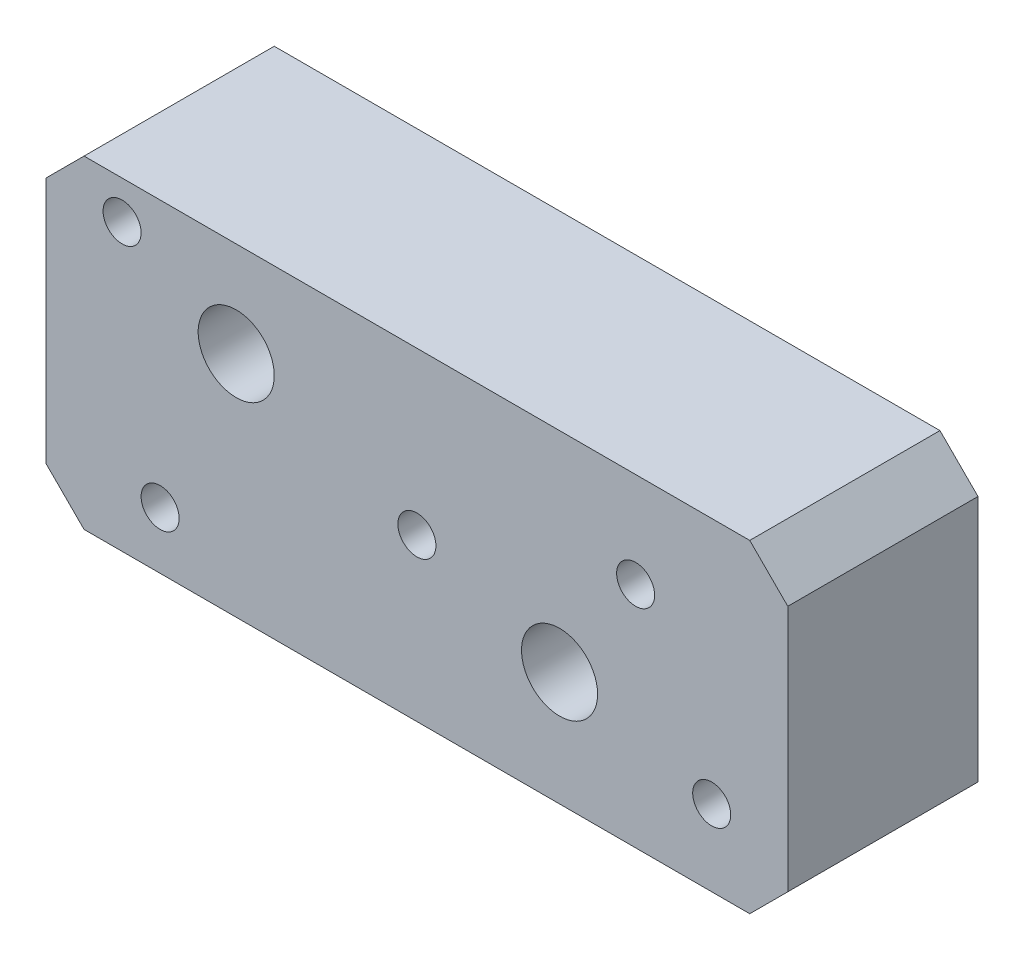
ISO-10303-21;
HEADER;
FILE_DESCRIPTION(('STEP AP214'),'2;1');
FILE_NAME('part.step','',(''),(''),'','','');
FILE_SCHEMA(('AUTOMOTIVE_DESIGN { 1 0 10303 214 1 1 1 1 }'));
ENDSEC;
DATA;
#1=APPLICATION_CONTEXT('core data for automotive mechanical design processes');
#2=APPLICATION_PROTOCOL_DEFINITION('international standard','automotive_design',2000,#1);
#3=PRODUCT_CONTEXT('',#1,'mechanical');
#4=PRODUCT('Part','Part','',(#3));
#5=PRODUCT_RELATED_PRODUCT_CATEGORY('part','',(#4));
#6=PRODUCT_DEFINITION_FORMATION('','',#4);
#7=PRODUCT_DEFINITION_CONTEXT('part definition',#1,'design');
#8=PRODUCT_DEFINITION('design','',#6,#7);
#9=PRODUCT_DEFINITION_SHAPE('','',#8);
#10=(LENGTH_UNIT() NAMED_UNIT(*) SI_UNIT(.MILLI.,.METRE.));
#11=(NAMED_UNIT(*) PLANE_ANGLE_UNIT() SI_UNIT($,.RADIAN.));
#12=(NAMED_UNIT(*) SI_UNIT($,.STERADIAN.) SOLID_ANGLE_UNIT());
#13=UNCERTAINTY_MEASURE_WITH_UNIT(LENGTH_MEASURE(1.E-05),#10,'distance_accuracy_value','');
#14=(GEOMETRIC_REPRESENTATION_CONTEXT(3) GLOBAL_UNCERTAINTY_ASSIGNED_CONTEXT((#13)) GLOBAL_UNIT_ASSIGNED_CONTEXT((#10,
#11,#12)) REPRESENTATION_CONTEXT('',''));
#15=CARTESIAN_POINT('',(0.,0.,0.));
#16=DIRECTION('',(0.,0.,1.));
#17=DIRECTION('',(1.,0.,0.));
#18=AXIS2_PLACEMENT_3D('',#15,#16,#17);
#19=CARTESIAN_POINT('',(0.,0.,5.));
#20=DIRECTION('',(0.,0.,-1.));
#21=DIRECTION('',(-1.,0.,0.));
#22=AXIS2_PLACEMENT_3D('',#19,#20,#21);
#23=PLANE('',#22);
#24=DIRECTION('',(-1.,0.,0.));
#25=VECTOR('',#24,1.);
#26=CARTESIAN_POINT('',(17.5,8.5,5.));
#27=LINE('',#26,#25);
#28=CARTESIAN_POINT('',(17.5,8.5,5.));
#29=VERTEX_POINT('',#28);
#30=CARTESIAN_POINT('',(-17.5,8.5,5.));
#31=VERTEX_POINT('',#30);
#32=EDGE_CURVE('E168',#29,#31,#27,.T.);
#33=ORIENTED_EDGE('',*,*,#32,.T.);
#34=DIRECTION('',(-0.707106781186547,-0.707106781186548,0.));
#35=VECTOR('',#34,1.);
#36=CARTESIAN_POINT('',(-17.5,8.5,5.));
#37=LINE('',#36,#35);
#38=CARTESIAN_POINT('',(-19.5,6.50000000000001,5.));
#39=VERTEX_POINT('',#38);
#40=EDGE_CURVE('E104',#31,#39,#37,.T.);
#41=ORIENTED_EDGE('',*,*,#40,.T.);
#42=DIRECTION('',(0.,-1.,0.));
#43=VECTOR('',#42,1.);
#44=CARTESIAN_POINT('',(-19.5,-6.50000000000001,5.));
#45=LINE('',#44,#43);
#46=CARTESIAN_POINT('',(-19.5,-6.50000000000001,5.));
#47=VERTEX_POINT('',#46);
#48=EDGE_CURVE('E189',#39,#47,#45,.T.);
#49=ORIENTED_EDGE('',*,*,#48,.T.);
#50=DIRECTION('',(0.707106781186548,-0.707106781186547,0.));
#51=VECTOR('',#50,1.);
#52=CARTESIAN_POINT('',(-17.5,-8.5,5.));
#53=LINE('',#52,#51);
#54=CARTESIAN_POINT('',(-17.5,-8.5,5.));
#55=VERTEX_POINT('',#54);
#56=EDGE_CURVE('E203',#47,#55,#53,.T.);
#57=ORIENTED_EDGE('',*,*,#56,.T.);
#58=DIRECTION('',(1.,0.,0.));
#59=VECTOR('',#58,1.);
#60=CARTESIAN_POINT('',(17.5,-8.49999999999999,5.));
#61=LINE('',#60,#59);
#62=CARTESIAN_POINT('',(17.5,-8.49999999999999,5.));
#63=VERTEX_POINT('',#62);
#64=EDGE_CURVE('E123',#55,#63,#61,.T.);
#65=ORIENTED_EDGE('',*,*,#64,.T.);
#66=DIRECTION('',(0.707106781186549,0.707106781186546,0.));
#67=VECTOR('',#66,1.);
#68=CARTESIAN_POINT('',(19.5,-6.5,5.));
#69=LINE('',#68,#67);
#70=CARTESIAN_POINT('',(19.5,-6.5,5.));
#71=VERTEX_POINT('',#70);
#72=EDGE_CURVE('E117',#63,#71,#69,.T.);
#73=ORIENTED_EDGE('',*,*,#72,.T.);
#74=DIRECTION('',(0.,1.,0.));
#75=VECTOR('',#74,1.);
#76=CARTESIAN_POINT('',(19.5,-6.5,5.));
#77=LINE('',#76,#75);
#78=CARTESIAN_POINT('',(19.5,6.5,5.));
#79=VERTEX_POINT('',#78);
#80=EDGE_CURVE('E121',#71,#79,#77,.T.);
#81=ORIENTED_EDGE('',*,*,#80,.T.);
#82=DIRECTION('',(-0.707106781186545,0.70710678118655,0.));
#83=VECTOR('',#82,1.);
#84=CARTESIAN_POINT('',(19.5,6.5,5.));
#85=LINE('',#84,#83);
#86=EDGE_CURVE('E61',#79,#29,#85,.T.);
#87=ORIENTED_EDGE('',*,*,#86,.T.);
#88=EDGE_LOOP('',(#33,#41,#49,#57,#65,#73,#81,#87));
#89=FACE_BOUND('',#88,.T.);
#90=CARTESIAN_POINT('',(0.,0.,5.));
#91=DIRECTION('',(0.,0.,1.));
#92=DIRECTION('',(1.,0.,0.));
#93=AXIS2_PLACEMENT_3D('',#90,#91,#92);
#94=CIRCLE('',#93,1.);
#95=CARTESIAN_POINT('',(1.,0.,5.));
#96=VERTEX_POINT('',#95);
#97=EDGE_CURVE('E150',#96,#96,#94,.T.);
#98=ORIENTED_EDGE('',*,*,#97,.F.);
#99=EDGE_LOOP('',(#98));
#100=FACE_BOUND('',#99,.T.);
#101=CARTESIAN_POINT('',(-13.5,-5.5,5.));
#102=DIRECTION('',(0.,0.,1.));
#103=DIRECTION('',(1.,0.,0.));
#104=AXIS2_PLACEMENT_3D('',#101,#102,#103);
#105=CIRCLE('',#104,1.);
#106=CARTESIAN_POINT('',(-12.5,-5.5,5.));
#107=VERTEX_POINT('',#106);
#108=EDGE_CURVE('E217',#107,#107,#105,.T.);
#109=ORIENTED_EDGE('',*,*,#108,.F.);
#110=EDGE_LOOP('',(#109));
#111=FACE_BOUND('',#110,.T.);
#112=CARTESIAN_POINT('',(-15.5,6.5,5.));
#113=DIRECTION('',(0.,0.,1.));
#114=DIRECTION('',(1.,0.,0.));
#115=AXIS2_PLACEMENT_3D('',#112,#113,#114);
#116=CIRCLE('',#115,1.);
#117=CARTESIAN_POINT('',(-14.5,6.5,5.));
#118=VERTEX_POINT('',#117);
#119=EDGE_CURVE('E225',#118,#118,#116,.T.);
#120=ORIENTED_EDGE('',*,*,#119,.F.);
#121=EDGE_LOOP('',(#120));
#122=FACE_BOUND('',#121,.T.);
#123=CARTESIAN_POINT('',(-9.5,3.5,5.));
#124=DIRECTION('',(0.,0.,1.));
#125=DIRECTION('',(1.,0.,0.));
#126=AXIS2_PLACEMENT_3D('',#123,#124,#125);
#127=CIRCLE('',#126,2.);
#128=CARTESIAN_POINT('',(-7.5,3.5,5.));
#129=VERTEX_POINT('',#128);
#130=EDGE_CURVE('E233',#129,#129,#127,.T.);
#131=ORIENTED_EDGE('',*,*,#130,.F.);
#132=EDGE_LOOP('',(#131));
#133=FACE_BOUND('',#132,.T.);
#134=CARTESIAN_POINT('',(7.5,-2.5,5.));
#135=DIRECTION('',(0.,0.,1.));
#136=DIRECTION('',(1.,0.,0.));
#137=AXIS2_PLACEMENT_3D('',#134,#135,#136);
#138=CIRCLE('',#137,2.);
#139=CARTESIAN_POINT('',(9.5,-2.5,5.));
#140=VERTEX_POINT('',#139);
#141=EDGE_CURVE('E241',#140,#140,#138,.T.);
#142=ORIENTED_EDGE('',*,*,#141,.F.);
#143=EDGE_LOOP('',(#142));
#144=FACE_BOUND('',#143,.T.);
#145=CARTESIAN_POINT('',(15.5,-4.5,5.));
#146=DIRECTION('',(0.,0.,1.));
#147=DIRECTION('',(1.,0.,0.));
#148=AXIS2_PLACEMENT_3D('',#145,#146,#147);
#149=CIRCLE('',#148,1.);
#150=CARTESIAN_POINT('',(16.5,-4.5,5.));
#151=VERTEX_POINT('',#150);
#152=EDGE_CURVE('E249',#151,#151,#149,.T.);
#153=ORIENTED_EDGE('',*,*,#152,.F.);
#154=EDGE_LOOP('',(#153));
#155=FACE_BOUND('',#154,.T.);
#156=CARTESIAN_POINT('',(11.5,3.5,5.));
#157=DIRECTION('',(0.,0.,1.));
#158=DIRECTION('',(1.,0.,0.));
#159=AXIS2_PLACEMENT_3D('',#156,#157,#158);
#160=CIRCLE('',#159,1.);
#161=CARTESIAN_POINT('',(12.5,3.5,5.));
#162=VERTEX_POINT('',#161);
#163=EDGE_CURVE('E257',#162,#162,#160,.T.);
#164=ORIENTED_EDGE('',*,*,#163,.F.);
#165=EDGE_LOOP('',(#164));
#166=FACE_BOUND('',#165,.T.);
#167=ADVANCED_FACE('F43',(#89,#100,#111,#122,#133,#144,#155,#166),#23,.F.);
#168=CARTESIAN_POINT('',(0.,0.,-5.));
#169=DIRECTION('',(0.,0.,-1.));
#170=DIRECTION('',(-1.,0.,0.));
#171=AXIS2_PLACEMENT_3D('',#168,#169,#170);
#172=PLANE('',#171);
#173=CARTESIAN_POINT('',(15.5,-4.5,-5.));
#174=DIRECTION('',(0.,0.,1.));
#175=DIRECTION('',(1.,0.,0.));
#176=AXIS2_PLACEMENT_3D('',#173,#174,#175);
#177=CIRCLE('',#176,1.);
#178=CARTESIAN_POINT('',(16.5,-4.5,-5.));
#179=VERTEX_POINT('',#178);
#180=EDGE_CURVE('E253',#179,#179,#177,.T.);
#181=ORIENTED_EDGE('',*,*,#180,.T.);
#182=EDGE_LOOP('',(#181));
#183=FACE_BOUND('',#182,.T.);
#184=CARTESIAN_POINT('',(-9.5,3.5,-5.));
#185=DIRECTION('',(0.,0.,1.));
#186=DIRECTION('',(1.,0.,0.));
#187=AXIS2_PLACEMENT_3D('',#184,#185,#186);
#188=CIRCLE('',#187,2.);
#189=CARTESIAN_POINT('',(-7.5,3.5,-5.));
#190=VERTEX_POINT('',#189);
#191=EDGE_CURVE('E237',#190,#190,#188,.T.);
#192=ORIENTED_EDGE('',*,*,#191,.T.);
#193=EDGE_LOOP('',(#192));
#194=FACE_BOUND('',#193,.T.);
#195=CARTESIAN_POINT('',(-13.5,-5.5,-5.));
#196=DIRECTION('',(0.,0.,1.));
#197=DIRECTION('',(1.,0.,0.));
#198=AXIS2_PLACEMENT_3D('',#195,#196,#197);
#199=CIRCLE('',#198,1.);
#200=CARTESIAN_POINT('',(-12.5,-5.5,-5.));
#201=VERTEX_POINT('',#200);
#202=EDGE_CURVE('E221',#201,#201,#199,.T.);
#203=ORIENTED_EDGE('',*,*,#202,.T.);
#204=EDGE_LOOP('',(#203));
#205=FACE_BOUND('',#204,.T.);
#206=DIRECTION('',(-1.,0.,0.));
#207=VECTOR('',#206,1.);
#208=CARTESIAN_POINT('',(17.5,8.5,-5.));
#209=LINE('',#208,#207);
#210=CARTESIAN_POINT('',(17.5,8.5,-5.));
#211=VERTEX_POINT('',#210);
#212=CARTESIAN_POINT('',(-17.5,8.5,-5.));
#213=VERTEX_POINT('',#212);
#214=EDGE_CURVE('E145',#211,#213,#209,.T.);
#215=ORIENTED_EDGE('',*,*,#214,.F.);
#216=DIRECTION('',(-0.707106781186545,0.70710678118655,0.));
#217=VECTOR('',#216,1.);
#218=CARTESIAN_POINT('',(19.5,6.5,-5.));
#219=LINE('',#218,#217);
#220=CARTESIAN_POINT('',(19.5,6.5,-5.));
#221=VERTEX_POINT('',#220);
#222=EDGE_CURVE('E96',#221,#211,#219,.T.);
#223=ORIENTED_EDGE('',*,*,#222,.F.);
#224=DIRECTION('',(0.,1.,0.));
#225=VECTOR('',#224,1.);
#226=CARTESIAN_POINT('',(19.5,-6.5,-5.));
#227=LINE('',#226,#225);
#228=CARTESIAN_POINT('',(19.5,-6.5,-5.));
#229=VERTEX_POINT('',#228);
#230=EDGE_CURVE('E90',#229,#221,#227,.T.);
#231=ORIENTED_EDGE('',*,*,#230,.F.);
#232=DIRECTION('',(0.707106781186549,0.707106781186546,0.));
#233=VECTOR('',#232,1.);
#234=CARTESIAN_POINT('',(19.5,-6.5,-5.));
#235=LINE('',#234,#233);
#236=CARTESIAN_POINT('',(17.5,-8.49999999999999,-5.));
#237=VERTEX_POINT('',#236);
#238=EDGE_CURVE('E132',#237,#229,#235,.T.);
#239=ORIENTED_EDGE('',*,*,#238,.F.);
#240=DIRECTION('',(1.,0.,0.));
#241=VECTOR('',#240,1.);
#242=CARTESIAN_POINT('',(17.5,-8.49999999999999,-5.));
#243=LINE('',#242,#241);
#244=CARTESIAN_POINT('',(-17.5,-8.5,-5.));
#245=VERTEX_POINT('',#244);
#246=EDGE_CURVE('E159',#245,#237,#243,.T.);
#247=ORIENTED_EDGE('',*,*,#246,.F.);
#248=DIRECTION('',(0.707106781186548,-0.707106781186547,0.));
#249=VECTOR('',#248,1.);
#250=CARTESIAN_POINT('',(-17.5,-8.5,-5.));
#251=LINE('',#250,#249);
#252=CARTESIAN_POINT('',(-19.5,-6.50000000000001,-5.));
#253=VERTEX_POINT('',#252);
#254=EDGE_CURVE('E156',#253,#245,#251,.T.);
#255=ORIENTED_EDGE('',*,*,#254,.F.);
#256=DIRECTION('',(0.,-1.,0.));
#257=VECTOR('',#256,1.);
#258=CARTESIAN_POINT('',(-19.5,-6.50000000000001,-5.));
#259=LINE('',#258,#257);
#260=CARTESIAN_POINT('',(-19.5,6.50000000000001,-5.));
#261=VERTEX_POINT('',#260);
#262=EDGE_CURVE('E153',#261,#253,#259,.T.);
#263=ORIENTED_EDGE('',*,*,#262,.F.);
#264=DIRECTION('',(-0.707106781186547,-0.707106781186548,0.));
#265=VECTOR('',#264,1.);
#266=CARTESIAN_POINT('',(-17.5,8.5,-5.));
#267=LINE('',#266,#265);
#268=EDGE_CURVE('E149',#213,#261,#267,.T.);
#269=ORIENTED_EDGE('',*,*,#268,.F.);
#270=EDGE_LOOP('',(#215,#223,#231,#239,#247,#255,#263,#269));
#271=FACE_BOUND('',#270,.T.);
#272=CARTESIAN_POINT('',(0.,0.,-5.));
#273=DIRECTION('',(0.,0.,1.));
#274=DIRECTION('',(1.,0.,0.));
#275=AXIS2_PLACEMENT_3D('',#272,#273,#274);
#276=CIRCLE('',#275,1.);
#277=CARTESIAN_POINT('',(1.,0.,-5.));
#278=VERTEX_POINT('',#277);
#279=EDGE_CURVE('E213',#278,#278,#276,.T.);
#280=ORIENTED_EDGE('',*,*,#279,.T.);
#281=EDGE_LOOP('',(#280));
#282=FACE_BOUND('',#281,.T.);
#283=CARTESIAN_POINT('',(-15.5,6.5,-5.));
#284=DIRECTION('',(0.,0.,1.));
#285=DIRECTION('',(1.,0.,0.));
#286=AXIS2_PLACEMENT_3D('',#283,#284,#285);
#287=CIRCLE('',#286,1.);
#288=CARTESIAN_POINT('',(-14.5,6.5,-5.));
#289=VERTEX_POINT('',#288);
#290=EDGE_CURVE('E229',#289,#289,#287,.T.);
#291=ORIENTED_EDGE('',*,*,#290,.T.);
#292=EDGE_LOOP('',(#291));
#293=FACE_BOUND('',#292,.T.);
#294=CARTESIAN_POINT('',(7.5,-2.5,-5.));
#295=DIRECTION('',(0.,0.,1.));
#296=DIRECTION('',(1.,0.,0.));
#297=AXIS2_PLACEMENT_3D('',#294,#295,#296);
#298=CIRCLE('',#297,2.);
#299=CARTESIAN_POINT('',(9.5,-2.5,-5.));
#300=VERTEX_POINT('',#299);
#301=EDGE_CURVE('E245',#300,#300,#298,.T.);
#302=ORIENTED_EDGE('',*,*,#301,.T.);
#303=EDGE_LOOP('',(#302));
#304=FACE_BOUND('',#303,.T.);
#305=CARTESIAN_POINT('',(11.5,3.5,-5.));
#306=DIRECTION('',(0.,0.,1.));
#307=DIRECTION('',(1.,0.,0.));
#308=AXIS2_PLACEMENT_3D('',#305,#306,#307);
#309=CIRCLE('',#308,1.);
#310=CARTESIAN_POINT('',(12.5,3.5,-5.));
#311=VERTEX_POINT('',#310);
#312=EDGE_CURVE('E261',#311,#311,#309,.T.);
#313=ORIENTED_EDGE('',*,*,#312,.T.);
#314=EDGE_LOOP('',(#313));
#315=FACE_BOUND('',#314,.T.);
#316=ADVANCED_FACE('F193',(#183,#194,#205,#271,#282,#293,#304,#315),#172,.T.);
#317=CARTESIAN_POINT('',(17.5,8.5,5.));
#318=DIRECTION('',(0.,-1.,0.));
#319=DIRECTION('',(1.,0.,0.));
#320=AXIS2_PLACEMENT_3D('',#317,#318,#319);
#321=PLANE('',#320);
#322=ORIENTED_EDGE('',*,*,#214,.T.);
#323=DIRECTION('',(0.,0.,-1.));
#324=VECTOR('',#323,1.);
#325=CARTESIAN_POINT('',(-17.5,8.5,5.));
#326=LINE('',#325,#324);
#327=EDGE_CURVE('E11',#31,#213,#326,.T.);
#328=ORIENTED_EDGE('',*,*,#327,.F.);
#329=ORIENTED_EDGE('',*,*,#32,.F.);
#330=DIRECTION('',(0.,0.,-1.));
#331=VECTOR('',#330,1.);
#332=CARTESIAN_POINT('',(17.5,8.5,5.));
#333=LINE('',#332,#331);
#334=EDGE_CURVE('E141',#29,#211,#333,.T.);
#335=ORIENTED_EDGE('',*,*,#334,.T.);
#336=EDGE_LOOP('',(#322,#328,#329,#335));
#337=FACE_BOUND('',#336,.T.);
#338=ADVANCED_FACE('F45',(#337),#321,.F.);
#339=CARTESIAN_POINT('',(-17.5,8.5,5.));
#340=DIRECTION('',(0.707106781186548,-0.707106781186547,0.));
#341=DIRECTION('',(0.707106781186547,0.707106781186548,0.));
#342=AXIS2_PLACEMENT_3D('',#339,#340,#341);
#343=PLANE('',#342);
#344=ORIENTED_EDGE('',*,*,#268,.T.);
#345=DIRECTION('',(0.,0.,-1.));
#346=VECTOR('',#345,1.);
#347=CARTESIAN_POINT('',(-19.5,6.50000000000001,5.));
#348=LINE('',#347,#346);
#349=EDGE_CURVE('E53',#39,#261,#348,.T.);
#350=ORIENTED_EDGE('',*,*,#349,.F.);
#351=ORIENTED_EDGE('',*,*,#40,.F.);
#352=ORIENTED_EDGE('',*,*,#327,.T.);
#353=EDGE_LOOP('',(#344,#350,#351,#352));
#354=FACE_BOUND('',#353,.T.);
#355=ADVANCED_FACE('F295',(#354),#343,.F.);
#356=CARTESIAN_POINT('',(-19.5,-6.50000000000001,5.));
#357=DIRECTION('',(1.,0.,0.));
#358=DIRECTION('',(0.,0.,-1.));
#359=AXIS2_PLACEMENT_3D('',#356,#357,#358);
#360=PLANE('',#359);
#361=ORIENTED_EDGE('',*,*,#262,.T.);
#362=DIRECTION('',(0.,0.,-1.));
#363=VECTOR('',#362,1.);
#364=CARTESIAN_POINT('',(-19.5,-6.50000000000001,5.));
#365=LINE('',#364,#363);
#366=EDGE_CURVE('E179',#47,#253,#365,.T.);
#367=ORIENTED_EDGE('',*,*,#366,.F.);
#368=ORIENTED_EDGE('',*,*,#48,.F.);
#369=ORIENTED_EDGE('',*,*,#349,.T.);
#370=EDGE_LOOP('',(#361,#367,#368,#369));
#371=FACE_BOUND('',#370,.T.);
#372=ADVANCED_FACE('F187',(#371),#360,.F.);
#373=CARTESIAN_POINT('',(-17.5,-8.5,5.));
#374=DIRECTION('',(0.707106781186547,0.707106781186548,0.));
#375=DIRECTION('',(-0.707106781186548,0.707106781186547,0.));
#376=AXIS2_PLACEMENT_3D('',#373,#374,#375);
#377=PLANE('',#376);
#378=ORIENTED_EDGE('',*,*,#254,.T.);
#379=DIRECTION('',(0.,0.,-1.));
#380=VECTOR('',#379,1.);
#381=CARTESIAN_POINT('',(-17.5,-8.5,5.));
#382=LINE('',#381,#380);
#383=EDGE_CURVE('E175',#55,#245,#382,.T.);
#384=ORIENTED_EDGE('',*,*,#383,.F.);
#385=ORIENTED_EDGE('',*,*,#56,.F.);
#386=ORIENTED_EDGE('',*,*,#366,.T.);
#387=EDGE_LOOP('',(#378,#384,#385,#386));
#388=FACE_BOUND('',#387,.T.);
#389=ADVANCED_FACE('F198',(#388),#377,.F.);
#390=CARTESIAN_POINT('',(17.5,-8.49999999999999,5.));
#391=DIRECTION('',(0.,1.,0.));
#392=DIRECTION('',(-1.,0.,0.));
#393=AXIS2_PLACEMENT_3D('',#390,#391,#392);
#394=PLANE('',#393);
#395=ORIENTED_EDGE('',*,*,#246,.T.);
#396=DIRECTION('',(0.,0.,-1.));
#397=VECTOR('',#396,1.);
#398=CARTESIAN_POINT('',(17.5,-8.49999999999999,5.));
#399=LINE('',#398,#397);
#400=EDGE_CURVE('E134',#63,#237,#399,.T.);
#401=ORIENTED_EDGE('',*,*,#400,.F.);
#402=ORIENTED_EDGE('',*,*,#64,.F.);
#403=ORIENTED_EDGE('',*,*,#383,.T.);
#404=EDGE_LOOP('',(#395,#401,#402,#403));
#405=FACE_BOUND('',#404,.T.);
#406=ADVANCED_FACE('F201',(#405),#394,.F.);
#407=CARTESIAN_POINT('',(19.5,-6.5,5.));
#408=DIRECTION('',(-0.707106781186546,0.707106781186549,0.));
#409=DIRECTION('',(-0.707106781186549,-0.707106781186546,0.));
#410=AXIS2_PLACEMENT_3D('',#407,#408,#409);
#411=PLANE('',#410);
#412=ORIENTED_EDGE('',*,*,#238,.T.);
#413=DIRECTION('',(0.,0.,-1.));
#414=VECTOR('',#413,1.);
#415=CARTESIAN_POINT('',(19.5,-6.5,5.));
#416=LINE('',#415,#414);
#417=EDGE_CURVE('E129',#71,#229,#416,.T.);
#418=ORIENTED_EDGE('',*,*,#417,.F.);
#419=ORIENTED_EDGE('',*,*,#72,.F.);
#420=ORIENTED_EDGE('',*,*,#400,.T.);
#421=EDGE_LOOP('',(#412,#418,#419,#420));
#422=FACE_BOUND('',#421,.T.);
#423=ADVANCED_FACE('F130',(#422),#411,.F.);
#424=CARTESIAN_POINT('',(19.5,-6.5,5.));
#425=DIRECTION('',(-1.,0.,0.));
#426=DIRECTION('',(0.,-1.,0.));
#427=AXIS2_PLACEMENT_3D('',#424,#425,#426);
#428=PLANE('',#427);
#429=ORIENTED_EDGE('',*,*,#230,.T.);
#430=DIRECTION('',(0.,0.,-1.));
#431=VECTOR('',#430,1.);
#432=CARTESIAN_POINT('',(19.5,6.5,5.));
#433=LINE('',#432,#431);
#434=EDGE_CURVE('E135',#79,#221,#433,.T.);
#435=ORIENTED_EDGE('',*,*,#434,.F.);
#436=ORIENTED_EDGE('',*,*,#80,.F.);
#437=ORIENTED_EDGE('',*,*,#417,.T.);
#438=EDGE_LOOP('',(#429,#435,#436,#437));
#439=FACE_BOUND('',#438,.T.);
#440=ADVANCED_FACE('F137',(#439),#428,.F.);
#441=CARTESIAN_POINT('',(19.5,6.5,5.));
#442=DIRECTION('',(-0.70710678118655,-0.707106781186545,0.));
#443=DIRECTION('',(0.707106781186545,-0.70710678118655,0.));
#444=AXIS2_PLACEMENT_3D('',#441,#442,#443);
#445=PLANE('',#444);
#446=ORIENTED_EDGE('',*,*,#222,.T.);
#447=ORIENTED_EDGE('',*,*,#334,.F.);
#448=ORIENTED_EDGE('',*,*,#86,.F.);
#449=ORIENTED_EDGE('',*,*,#434,.T.);
#450=EDGE_LOOP('',(#446,#447,#448,#449));
#451=FACE_BOUND('',#450,.T.);
#452=ADVANCED_FACE('F283',(#451),#445,.F.);
#453=CARTESIAN_POINT('',(0.,0.,5.));
#454=DIRECTION('',(0.,0.,-1.));
#455=DIRECTION('',(-1.,0.,0.));
#456=AXIS2_PLACEMENT_3D('',#453,#454,#455);
#457=CYLINDRICAL_SURFACE('',#456,1.);
#458=ORIENTED_EDGE('',*,*,#97,.T.);
#459=EDGE_LOOP('',(#458));
#460=FACE_BOUND('',#459,.T.);
#461=ORIENTED_EDGE('',*,*,#279,.F.);
#462=EDGE_LOOP('',(#461));
#463=FACE_BOUND('',#462,.T.);
#464=ADVANCED_FACE('F280',(#460,#463),#457,.F.);
#465=CARTESIAN_POINT('',(-13.5,-5.5,5.));
#466=DIRECTION('',(0.,0.,-1.));
#467=DIRECTION('',(-1.,0.,0.));
#468=AXIS2_PLACEMENT_3D('',#465,#466,#467);
#469=CYLINDRICAL_SURFACE('',#468,1.);
#470=ORIENTED_EDGE('',*,*,#108,.T.);
#471=EDGE_LOOP('',(#470));
#472=FACE_BOUND('',#471,.T.);
#473=ORIENTED_EDGE('',*,*,#202,.F.);
#474=EDGE_LOOP('',(#473));
#475=FACE_BOUND('',#474,.T.);
#476=ADVANCED_FACE('F371',(#472,#475),#469,.F.);
#477=CARTESIAN_POINT('',(-15.5,6.5,5.));
#478=DIRECTION('',(0.,0.,-1.));
#479=DIRECTION('',(-1.,0.,0.));
#480=AXIS2_PLACEMENT_3D('',#477,#478,#479);
#481=CYLINDRICAL_SURFACE('',#480,1.);
#482=ORIENTED_EDGE('',*,*,#119,.T.);
#483=EDGE_LOOP('',(#482));
#484=FACE_BOUND('',#483,.T.);
#485=ORIENTED_EDGE('',*,*,#290,.F.);
#486=EDGE_LOOP('',(#485));
#487=FACE_BOUND('',#486,.T.);
#488=ADVANCED_FACE('F380',(#484,#487),#481,.F.);
#489=CARTESIAN_POINT('',(-9.5,3.5,5.));
#490=DIRECTION('',(0.,0.,-1.));
#491=DIRECTION('',(-1.,0.,0.));
#492=AXIS2_PLACEMENT_3D('',#489,#490,#491);
#493=CYLINDRICAL_SURFACE('',#492,2.);
#494=ORIENTED_EDGE('',*,*,#130,.T.);
#495=EDGE_LOOP('',(#494));
#496=FACE_BOUND('',#495,.T.);
#497=ORIENTED_EDGE('',*,*,#191,.F.);
#498=EDGE_LOOP('',(#497));
#499=FACE_BOUND('',#498,.T.);
#500=ADVANCED_FACE('F389',(#496,#499),#493,.F.);
#501=CARTESIAN_POINT('',(7.5,-2.5,5.));
#502=DIRECTION('',(0.,0.,-1.));
#503=DIRECTION('',(-1.,0.,0.));
#504=AXIS2_PLACEMENT_3D('',#501,#502,#503);
#505=CYLINDRICAL_SURFACE('',#504,2.);
#506=ORIENTED_EDGE('',*,*,#141,.T.);
#507=EDGE_LOOP('',(#506));
#508=FACE_BOUND('',#507,.T.);
#509=ORIENTED_EDGE('',*,*,#301,.F.);
#510=EDGE_LOOP('',(#509));
#511=FACE_BOUND('',#510,.T.);
#512=ADVANCED_FACE('F399',(#508,#511),#505,.F.);
#513=CARTESIAN_POINT('',(15.5,-4.5,5.));
#514=DIRECTION('',(0.,0.,-1.));
#515=DIRECTION('',(-1.,0.,0.));
#516=AXIS2_PLACEMENT_3D('',#513,#514,#515);
#517=CYLINDRICAL_SURFACE('',#516,1.);
#518=ORIENTED_EDGE('',*,*,#152,.T.);
#519=EDGE_LOOP('',(#518));
#520=FACE_BOUND('',#519,.T.);
#521=ORIENTED_EDGE('',*,*,#180,.F.);
#522=EDGE_LOOP('',(#521));
#523=FACE_BOUND('',#522,.T.);
#524=ADVANCED_FACE('F409',(#520,#523),#517,.F.);
#525=CARTESIAN_POINT('',(11.5,3.5,5.));
#526=DIRECTION('',(0.,0.,-1.));
#527=DIRECTION('',(-1.,0.,0.));
#528=AXIS2_PLACEMENT_3D('',#525,#526,#527);
#529=CYLINDRICAL_SURFACE('',#528,1.);
#530=ORIENTED_EDGE('',*,*,#163,.T.);
#531=EDGE_LOOP('',(#530));
#532=FACE_BOUND('',#531,.T.);
#533=ORIENTED_EDGE('',*,*,#312,.F.);
#534=EDGE_LOOP('',(#533));
#535=FACE_BOUND('',#534,.T.);
#536=ADVANCED_FACE('F269',(#532,#535),#529,.F.);
#537=CLOSED_SHELL('',(#167,#316,#338,#355,#372,#389,#406,#423,#440,#452,#464,#476,#488,#500,
#512,#524,#536));
#538=MANIFOLD_SOLID_BREP('B2',#537);
#539=ADVANCED_BREP_SHAPE_REPRESENTATION('',(#18,#538),#14);
#540=SHAPE_DEFINITION_REPRESENTATION(#9,#539);
ENDSEC;
END-ISO-10303-21;
